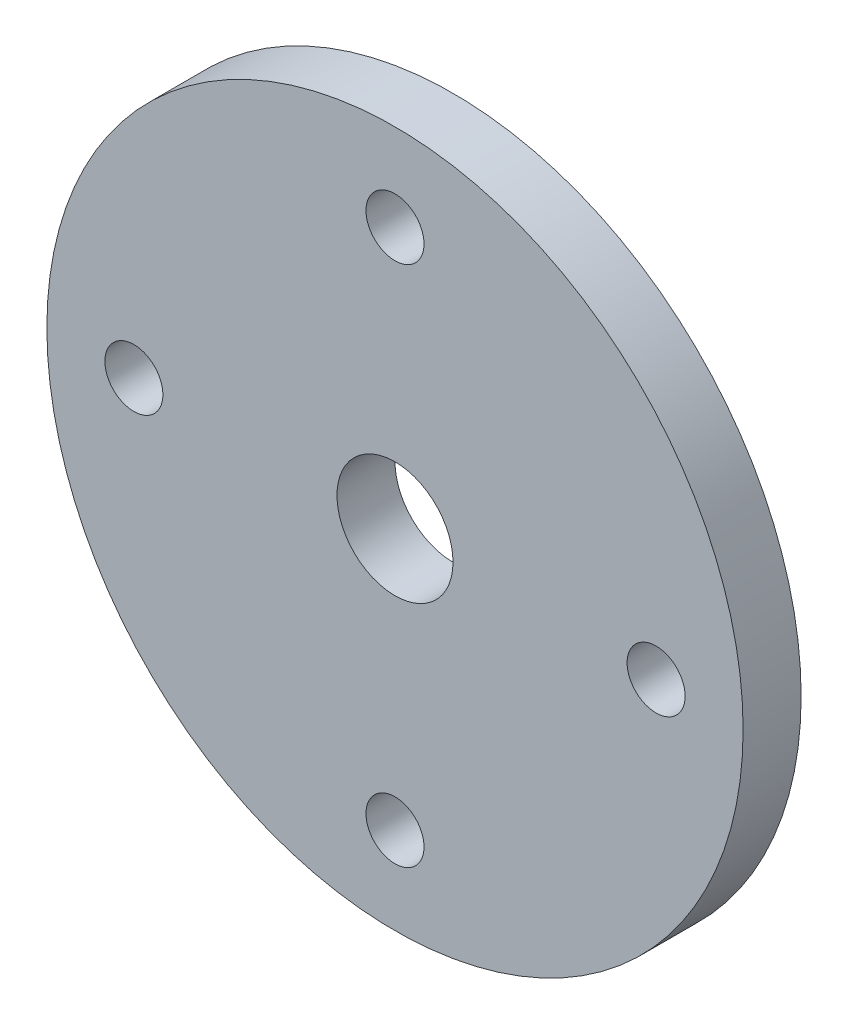
ISO-10303-21;
HEADER;
FILE_DESCRIPTION(('STEP AP214'),'2;1');
FILE_NAME('part.step','',(''),(''),'','','');
FILE_SCHEMA(('AUTOMOTIVE_DESIGN { 1 0 10303 214 1 1 1 1 }'));
ENDSEC;
DATA;
#1=APPLICATION_CONTEXT('core data for automotive mechanical design processes');
#2=APPLICATION_PROTOCOL_DEFINITION('international standard','automotive_design',2000,#1);
#3=PRODUCT_CONTEXT('',#1,'mechanical');
#4=PRODUCT('Part','Part','',(#3));
#5=PRODUCT_RELATED_PRODUCT_CATEGORY('part','',(#4));
#6=PRODUCT_DEFINITION_FORMATION('','',#4);
#7=PRODUCT_DEFINITION_CONTEXT('part definition',#1,'design');
#8=PRODUCT_DEFINITION('design','',#6,#7);
#9=PRODUCT_DEFINITION_SHAPE('','',#8);
#10=(LENGTH_UNIT() NAMED_UNIT(*) SI_UNIT(.MILLI.,.METRE.));
#11=(NAMED_UNIT(*) PLANE_ANGLE_UNIT() SI_UNIT($,.RADIAN.));
#12=(NAMED_UNIT(*) SI_UNIT($,.STERADIAN.) SOLID_ANGLE_UNIT());
#13=UNCERTAINTY_MEASURE_WITH_UNIT(LENGTH_MEASURE(1.E-05),#10,'distance_accuracy_value','');
#14=(GEOMETRIC_REPRESENTATION_CONTEXT(3) GLOBAL_UNCERTAINTY_ASSIGNED_CONTEXT((#13)) GLOBAL_UNIT_ASSIGNED_CONTEXT((#10,
#11,#12)) REPRESENTATION_CONTEXT('',''));
#15=CARTESIAN_POINT('',(0.,0.,0.));
#16=DIRECTION('',(0.,0.,1.));
#17=DIRECTION('',(1.,0.,0.));
#18=AXIS2_PLACEMENT_3D('',#15,#16,#17);
#19=CARTESIAN_POINT('',(0.,0.,5.));
#20=DIRECTION('',(0.,0.,-1.));
#21=DIRECTION('',(-1.,0.,0.));
#22=AXIS2_PLACEMENT_3D('',#19,#20,#21);
#23=CYLINDRICAL_SURFACE('',#22,30.);
#24=CARTESIAN_POINT('',(0.,0.,5.));
#25=DIRECTION('',(0.,0.,1.));
#26=DIRECTION('',(1.,0.,0.));
#27=AXIS2_PLACEMENT_3D('',#24,#25,#26);
#28=CIRCLE('',#27,30.);
#29=CARTESIAN_POINT('',(30.,0.,5.));
#30=VERTEX_POINT('',#29);
#31=EDGE_CURVE('E10',#30,#30,#28,.T.);
#32=ORIENTED_EDGE('',*,*,#31,.F.);
#33=EDGE_LOOP('',(#32));
#34=FACE_BOUND('',#33,.T.);
#35=CARTESIAN_POINT('',(0.,0.,0.));
#36=DIRECTION('',(0.,0.,1.));
#37=DIRECTION('',(1.,0.,0.));
#38=AXIS2_PLACEMENT_3D('',#35,#36,#37);
#39=CIRCLE('',#38,30.);
#40=CARTESIAN_POINT('',(30.,0.,0.));
#41=VERTEX_POINT('',#40);
#42=EDGE_CURVE('E48',#41,#41,#39,.T.);
#43=ORIENTED_EDGE('',*,*,#42,.T.);
#44=EDGE_LOOP('',(#43));
#45=FACE_BOUND('',#44,.T.);
#46=ADVANCED_FACE('F41',(#34,#45),#23,.T.);
#47=CARTESIAN_POINT('',(0.,0.,5.));
#48=DIRECTION('',(0.,0.,1.));
#49=DIRECTION('',(1.,0.,0.));
#50=AXIS2_PLACEMENT_3D('',#47,#48,#49);
#51=PLANE('',#50);
#52=CARTESIAN_POINT('',(0.,22.5,5.));
#53=DIRECTION('',(0.,0.,1.));
#54=DIRECTION('',(1.,0.,0.));
#55=AXIS2_PLACEMENT_3D('',#52,#53,#54);
#56=CIRCLE('',#55,2.49999999999999);
#57=CARTESIAN_POINT('',(2.49999999999999,22.5,5.));
#58=VERTEX_POINT('',#57);
#59=EDGE_CURVE('E83',#58,#58,#56,.T.);
#60=ORIENTED_EDGE('',*,*,#59,.F.);
#61=EDGE_LOOP('',(#60));
#62=FACE_BOUND('',#61,.T.);
#63=CARTESIAN_POINT('',(0.,-22.5,5.));
#64=DIRECTION('',(0.,0.,1.));
#65=DIRECTION('',(1.,0.,0.));
#66=AXIS2_PLACEMENT_3D('',#63,#64,#65);
#67=CIRCLE('',#66,2.49999999999999);
#68=CARTESIAN_POINT('',(2.49999999999999,-22.5,5.));
#69=VERTEX_POINT('',#68);
#70=EDGE_CURVE('E77',#69,#69,#67,.T.);
#71=ORIENTED_EDGE('',*,*,#70,.F.);
#72=EDGE_LOOP('',(#71));
#73=FACE_BOUND('',#72,.T.);
#74=CARTESIAN_POINT('',(-22.5,0.,5.));
#75=DIRECTION('',(0.,0.,1.));
#76=DIRECTION('',(1.,0.,0.));
#77=AXIS2_PLACEMENT_3D('',#74,#75,#76);
#78=CIRCLE('',#77,2.49999999999999);
#79=CARTESIAN_POINT('',(-20.,0.,5.));
#80=VERTEX_POINT('',#79);
#81=EDGE_CURVE('E70',#80,#80,#78,.T.);
#82=ORIENTED_EDGE('',*,*,#81,.F.);
#83=EDGE_LOOP('',(#82));
#84=FACE_BOUND('',#83,.T.);
#85=CARTESIAN_POINT('',(22.5,0.,5.));
#86=DIRECTION('',(0.,0.,1.));
#87=DIRECTION('',(1.,0.,0.));
#88=AXIS2_PLACEMENT_3D('',#85,#86,#87);
#89=CIRCLE('',#88,2.49999999999999);
#90=CARTESIAN_POINT('',(25.,0.,5.));
#91=VERTEX_POINT('',#90);
#92=EDGE_CURVE('E62',#91,#91,#89,.T.);
#93=ORIENTED_EDGE('',*,*,#92,.F.);
#94=EDGE_LOOP('',(#93));
#95=FACE_BOUND('',#94,.T.);
#96=CARTESIAN_POINT('',(0.,0.,5.));
#97=DIRECTION('',(0.,0.,1.));
#98=DIRECTION('',(1.,0.,0.));
#99=AXIS2_PLACEMENT_3D('',#96,#97,#98);
#100=CIRCLE('',#99,5.);
#101=CARTESIAN_POINT('',(5.,0.,4.99999999999999));
#102=VERTEX_POINT('',#101);
#103=EDGE_CURVE('E56',#102,#102,#100,.T.);
#104=ORIENTED_EDGE('',*,*,#103,.F.);
#105=EDGE_LOOP('',(#104));
#106=FACE_BOUND('',#105,.T.);
#107=ORIENTED_EDGE('',*,*,#31,.T.);
#108=EDGE_LOOP('',(#107));
#109=FACE_BOUND('',#108,.T.);
#110=ADVANCED_FACE('F90',(#62,#73,#84,#95,#106,#109),#51,.T.);
#111=CARTESIAN_POINT('',(0.,0.,0.));
#112=DIRECTION('',(0.,0.,1.));
#113=DIRECTION('',(1.,0.,0.));
#114=AXIS2_PLACEMENT_3D('',#111,#112,#113);
#115=PLANE('',#114);
#116=CARTESIAN_POINT('',(0.,22.5,0.));
#117=DIRECTION('',(0.,0.,1.));
#118=DIRECTION('',(1.,0.,0.));
#119=AXIS2_PLACEMENT_3D('',#116,#117,#118);
#120=CIRCLE('',#119,2.49999999999999);
#121=CARTESIAN_POINT('',(2.49999999999999,22.5,0.));
#122=VERTEX_POINT('',#121);
#123=EDGE_CURVE('E80',#122,#122,#120,.T.);
#124=ORIENTED_EDGE('',*,*,#123,.T.);
#125=EDGE_LOOP('',(#124));
#126=FACE_BOUND('',#125,.T.);
#127=CARTESIAN_POINT('',(0.,-22.5,0.));
#128=DIRECTION('',(0.,0.,1.));
#129=DIRECTION('',(1.,0.,0.));
#130=AXIS2_PLACEMENT_3D('',#127,#128,#129);
#131=CIRCLE('',#130,2.49999999999999);
#132=CARTESIAN_POINT('',(2.49999999999999,-22.5,0.));
#133=VERTEX_POINT('',#132);
#134=EDGE_CURVE('E74',#133,#133,#131,.T.);
#135=ORIENTED_EDGE('',*,*,#134,.T.);
#136=EDGE_LOOP('',(#135));
#137=FACE_BOUND('',#136,.T.);
#138=CARTESIAN_POINT('',(-22.5,0.,0.));
#139=DIRECTION('',(0.,0.,1.));
#140=DIRECTION('',(1.,0.,0.));
#141=AXIS2_PLACEMENT_3D('',#138,#139,#140);
#142=CIRCLE('',#141,2.49999999999999);
#143=CARTESIAN_POINT('',(-20.,0.,0.));
#144=VERTEX_POINT('',#143);
#145=EDGE_CURVE('E44',#144,#144,#142,.T.);
#146=ORIENTED_EDGE('',*,*,#145,.T.);
#147=EDGE_LOOP('',(#146));
#148=FACE_BOUND('',#147,.T.);
#149=CARTESIAN_POINT('',(22.5,0.,0.));
#150=DIRECTION('',(0.,0.,1.));
#151=DIRECTION('',(1.,0.,0.));
#152=AXIS2_PLACEMENT_3D('',#149,#150,#151);
#153=CIRCLE('',#152,2.49999999999999);
#154=CARTESIAN_POINT('',(25.,0.,0.));
#155=VERTEX_POINT('',#154);
#156=EDGE_CURVE('E60',#155,#155,#153,.T.);
#157=ORIENTED_EDGE('',*,*,#156,.T.);
#158=EDGE_LOOP('',(#157));
#159=FACE_BOUND('',#158,.T.);
#160=CARTESIAN_POINT('',(0.,0.,0.));
#161=DIRECTION('',(0.,0.,1.));
#162=DIRECTION('',(1.,0.,0.));
#163=AXIS2_PLACEMENT_3D('',#160,#161,#162);
#164=CIRCLE('',#163,5.);
#165=CARTESIAN_POINT('',(5.,0.,0.));
#166=VERTEX_POINT('',#165);
#167=EDGE_CURVE('E53',#166,#166,#164,.T.);
#168=ORIENTED_EDGE('',*,*,#167,.T.);
#169=EDGE_LOOP('',(#168));
#170=FACE_BOUND('',#169,.T.);
#171=ORIENTED_EDGE('',*,*,#42,.F.);
#172=EDGE_LOOP('',(#171));
#173=FACE_BOUND('',#172,.T.);
#174=ADVANCED_FACE('F93',(#126,#137,#148,#159,#170,#173),#115,.F.);
#175=CARTESIAN_POINT('',(0.,0.,-88.));
#176=DIRECTION('',(0.,0.,1.));
#177=DIRECTION('',(1.,0.,0.));
#178=AXIS2_PLACEMENT_3D('',#175,#176,#177);
#179=CYLINDRICAL_SURFACE('',#178,5.);
#180=CARTESIAN_POINT('',(5.,0.,4.99999999999999));
#181=CARTESIAN_POINT('',(5.,0.,4.94791666666666));
#182=CARTESIAN_POINT('',(5.,0.,4.89583333333333));
#183=CARTESIAN_POINT('',(5.,0.,4.79166666666666));
#184=CARTESIAN_POINT('',(5.,0.,4.73958333333333));
#185=CARTESIAN_POINT('',(5.,0.,4.63541666666666));
#186=CARTESIAN_POINT('',(5.,0.,4.58333333333332));
#187=CARTESIAN_POINT('',(5.,0.,4.47916666666665));
#188=CARTESIAN_POINT('',(5.,0.,4.42708333333332));
#189=CARTESIAN_POINT('',(5.,0.,4.32291666666666));
#190=CARTESIAN_POINT('',(5.,0.,4.27083333333333));
#191=CARTESIAN_POINT('',(5.,0.,4.16666666666666));
#192=CARTESIAN_POINT('',(5.,0.,4.11458333333332));
#193=CARTESIAN_POINT('',(5.,0.,4.01041666666665));
#194=CARTESIAN_POINT('',(5.,0.,3.95833333333332));
#195=CARTESIAN_POINT('',(5.,0.,3.85416666666665));
#196=CARTESIAN_POINT('',(5.,0.,3.80208333333332));
#197=CARTESIAN_POINT('',(5.,0.,3.69791666666666));
#198=CARTESIAN_POINT('',(5.,0.,3.64583333333333));
#199=CARTESIAN_POINT('',(5.,0.,3.54166666666666));
#200=CARTESIAN_POINT('',(5.,0.,3.48958333333333));
#201=CARTESIAN_POINT('',(5.,0.,3.38541666666666));
#202=CARTESIAN_POINT('',(5.,0.,3.33333333333332));
#203=CARTESIAN_POINT('',(5.,0.,3.22916666666665));
#204=CARTESIAN_POINT('',(5.,0.,3.17708333333332));
#205=CARTESIAN_POINT('',(5.,0.,3.07291666666666));
#206=CARTESIAN_POINT('',(5.,0.,3.02083333333332));
#207=CARTESIAN_POINT('',(5.,0.,2.91666666666666));
#208=CARTESIAN_POINT('',(5.,0.,2.86458333333332));
#209=CARTESIAN_POINT('',(5.,0.,2.76041666666665));
#210=CARTESIAN_POINT('',(5.,0.,2.70833333333332));
#211=CARTESIAN_POINT('',(5.,0.,2.60416666666665));
#212=CARTESIAN_POINT('',(5.,0.,2.55208333333332));
#213=CARTESIAN_POINT('',(5.,0.,2.44791666666666));
#214=CARTESIAN_POINT('',(5.,0.,2.39583333333332));
#215=CARTESIAN_POINT('',(5.,0.,2.29166666666666));
#216=CARTESIAN_POINT('',(5.,0.,2.23958333333333));
#217=CARTESIAN_POINT('',(5.,0.,2.13541666666666));
#218=CARTESIAN_POINT('',(5.,0.,2.08333333333332));
#219=CARTESIAN_POINT('',(5.,0.,1.97916666666665));
#220=CARTESIAN_POINT('',(5.,0.,1.92708333333332));
#221=CARTESIAN_POINT('',(5.,0.,1.82291666666666));
#222=CARTESIAN_POINT('',(5.,0.,1.77083333333332));
#223=CARTESIAN_POINT('',(5.,0.,1.66666666666665));
#224=CARTESIAN_POINT('',(5.,0.,1.61458333333332));
#225=CARTESIAN_POINT('',(5.,0.,1.51041666666665));
#226=CARTESIAN_POINT('',(5.,0.,1.45833333333332));
#227=CARTESIAN_POINT('',(5.,0.,1.35416666666665));
#228=CARTESIAN_POINT('',(5.,0.,1.30208333333332));
#229=CARTESIAN_POINT('',(5.,0.,1.19791666666665));
#230=CARTESIAN_POINT('',(5.,0.,1.14583333333332));
#231=CARTESIAN_POINT('',(5.,0.,1.04166666666666));
#232=CARTESIAN_POINT('',(5.,0.,0.989583333333326));
#233=CARTESIAN_POINT('',(5.,0.,0.885416666666657));
#234=CARTESIAN_POINT('',(5.,0.,0.83333333333332));
#235=CARTESIAN_POINT('',(5.,0.,0.729166666666651));
#236=CARTESIAN_POINT('',(5.,0.,0.677083333333319));
#237=CARTESIAN_POINT('',(5.,0.,0.572916666666654));
#238=CARTESIAN_POINT('',(5.,0.,0.520833333333322));
#239=CARTESIAN_POINT('',(5.,0.,0.416666666666653));
#240=CARTESIAN_POINT('',(5.,0.,0.364583333333316));
#241=CARTESIAN_POINT('',(5.,0.,0.260416666666647));
#242=CARTESIAN_POINT('',(5.,0.,0.208333333333315));
#243=CARTESIAN_POINT('',(5.,0.,0.104166666666651));
#244=CARTESIAN_POINT('',(5.,0.,0.0520833333333183));
#245=CARTESIAN_POINT('',(5.,0.,0.));
#246=B_SPLINE_CURVE_WITH_KNOTS('',3,(#180,#181,#182,#183,#184,#185,#186,#187,#188,#189,#190,
#191,#192,#193,#194,#195,#196,#197,#198,#199,#200,#201,#202,#203,#204,#205,#206,#207,#208,#209,
#210,#211,#212,#213,#214,#215,#216,#217,#218,#219,#220,#221,#222,#223,#224,#225,#226,#227,#228,
#229,#230,#231,#232,#233,#234,#235,#236,#237,#238,#239,#240,#241,#242,#243,#244,#245),
.UNSPECIFIED.,.F.,.F.,(4,2,2,2,2,2,2,2,2,2,2,2,2,2,2,2,2,2,2,2,2,2,2,2,2,2,2,2,2,2,2,2,4),(0.,
0.156249999999997,0.312499999999993,0.468750000000004,0.625000000000001,0.781249999999997,
0.937500000000008,1.09375,1.25,1.40625,1.56249999999999,1.71875,1.875,2.03125,2.18750000000001,
2.34375000000001,2.5,2.65625,2.8125,2.96875000000001,3.125,3.28125,3.43750000000001,
3.59375000000001,3.75,3.90625,4.0625,4.21875000000001,4.375,4.53125,4.68750000000001,
4.84375000000001,5.),.UNSPECIFIED.);
#247=EDGE_CURVE('BSEAM102',#102,#166,#246,.T.);
#248=ORIENTED_EDGE('',*,*,#103,.T.);
#249=ORIENTED_EDGE('',*,*,#167,.F.);
#250=ORIENTED_EDGE('',*,*,#247,.T.);
#251=ORIENTED_EDGE('',*,*,#247,.F.);
#252=EDGE_LOOP('',(#248,#250,#249,#251));
#253=FACE_BOUND('',#252,.T.);
#254=ADVANCED_FACE('F102',(#253),#179,.F.);
#255=CARTESIAN_POINT('',(22.5,0.,5.));
#256=DIRECTION('',(0.,0.,1.));
#257=DIRECTION('',(1.,0.,0.));
#258=AXIS2_PLACEMENT_3D('',#255,#256,#257);
#259=CYLINDRICAL_SURFACE('',#258,2.49999999999999);
#260=ORIENTED_EDGE('',*,*,#92,.T.);
#261=EDGE_LOOP('',(#260));
#262=FACE_BOUND('',#261,.T.);
#263=ORIENTED_EDGE('',*,*,#156,.F.);
#264=EDGE_LOOP('',(#263));
#265=FACE_BOUND('',#264,.T.);
#266=ADVANCED_FACE('F105',(#262,#265),#259,.F.);
#267=CARTESIAN_POINT('',(-22.5,0.,5.));
#268=DIRECTION('',(0.,0.,1.));
#269=DIRECTION('',(1.,0.,0.));
#270=AXIS2_PLACEMENT_3D('',#267,#268,#269);
#271=CYLINDRICAL_SURFACE('',#270,2.49999999999999);
#272=ORIENTED_EDGE('',*,*,#81,.T.);
#273=EDGE_LOOP('',(#272));
#274=FACE_BOUND('',#273,.T.);
#275=ORIENTED_EDGE('',*,*,#145,.F.);
#276=EDGE_LOOP('',(#275));
#277=FACE_BOUND('',#276,.T.);
#278=ADVANCED_FACE('F146',(#274,#277),#271,.F.);
#279=CARTESIAN_POINT('',(0.,-22.5,5.));
#280=DIRECTION('',(0.,0.,1.));
#281=DIRECTION('',(1.,0.,0.));
#282=AXIS2_PLACEMENT_3D('',#279,#280,#281);
#283=CYLINDRICAL_SURFACE('',#282,2.49999999999999);
#284=ORIENTED_EDGE('',*,*,#70,.T.);
#285=EDGE_LOOP('',(#284));
#286=FACE_BOUND('',#285,.T.);
#287=ORIENTED_EDGE('',*,*,#134,.F.);
#288=EDGE_LOOP('',(#287));
#289=FACE_BOUND('',#288,.T.);
#290=ADVANCED_FACE('F157',(#286,#289),#283,.F.);
#291=CARTESIAN_POINT('',(0.,22.5,5.));
#292=DIRECTION('',(0.,0.,1.));
#293=DIRECTION('',(1.,0.,0.));
#294=AXIS2_PLACEMENT_3D('',#291,#292,#293);
#295=CYLINDRICAL_SURFACE('',#294,2.49999999999999);
#296=ORIENTED_EDGE('',*,*,#59,.T.);
#297=EDGE_LOOP('',(#296));
#298=FACE_BOUND('',#297,.T.);
#299=ORIENTED_EDGE('',*,*,#123,.F.);
#300=EDGE_LOOP('',(#299));
#301=FACE_BOUND('',#300,.T.);
#302=ADVANCED_FACE('F87',(#298,#301),#295,.F.);
#303=CLOSED_SHELL('',(#46,#110,#174,#254,#266,#278,#290,#302));
#304=MANIFOLD_SOLID_BREP('B2',#303);
#305=ADVANCED_BREP_SHAPE_REPRESENTATION('',(#18,#304),#14);
#306=SHAPE_DEFINITION_REPRESENTATION(#9,#305);
ENDSEC;
END-ISO-10303-21;
